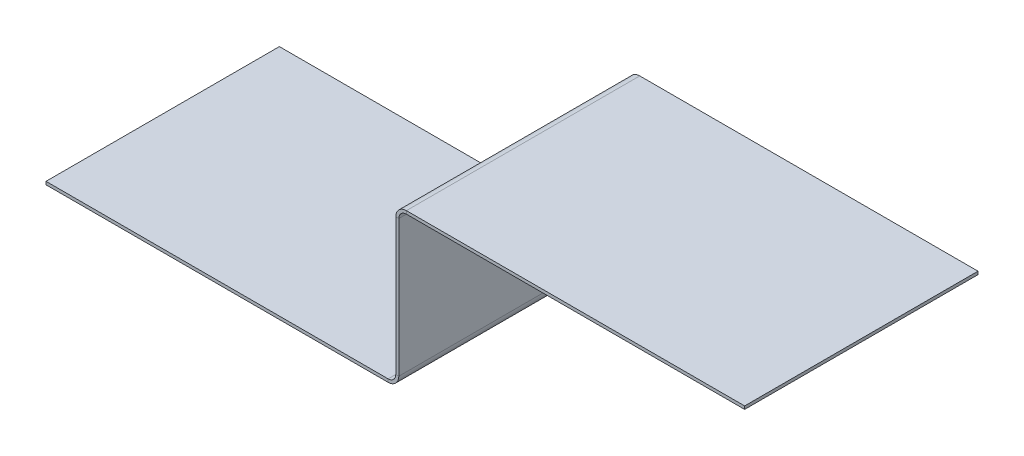
ISO-10303-21;
HEADER;
FILE_DESCRIPTION(('STEP AP214'),'2;1');
FILE_NAME('part.step','',(''),(''),'','','');
FILE_SCHEMA(('AUTOMOTIVE_DESIGN { 1 0 10303 214 1 1 1 1 }'));
ENDSEC;
DATA;
#1=APPLICATION_CONTEXT('core data for automotive mechanical design processes');
#2=APPLICATION_PROTOCOL_DEFINITION('international standard','automotive_design',2000,#1);
#3=PRODUCT_CONTEXT('',#1,'mechanical');
#4=PRODUCT('Part','Part','',(#3));
#5=PRODUCT_RELATED_PRODUCT_CATEGORY('part','',(#4));
#6=PRODUCT_DEFINITION_FORMATION('','',#4);
#7=PRODUCT_DEFINITION_CONTEXT('part definition',#1,'design');
#8=PRODUCT_DEFINITION('design','',#6,#7);
#9=PRODUCT_DEFINITION_SHAPE('','',#8);
#10=(LENGTH_UNIT() NAMED_UNIT(*) SI_UNIT(.MILLI.,.METRE.));
#11=(NAMED_UNIT(*) PLANE_ANGLE_UNIT() SI_UNIT($,.RADIAN.));
#12=(NAMED_UNIT(*) SI_UNIT($,.STERADIAN.) SOLID_ANGLE_UNIT());
#13=UNCERTAINTY_MEASURE_WITH_UNIT(LENGTH_MEASURE(1.E-05),#10,'distance_accuracy_value','');
#14=(GEOMETRIC_REPRESENTATION_CONTEXT(3) GLOBAL_UNCERTAINTY_ASSIGNED_CONTEXT((#13)) GLOBAL_UNIT_ASSIGNED_CONTEXT((#10,
#11,#12)) REPRESENTATION_CONTEXT('',''));
#15=CARTESIAN_POINT('',(0.,0.,0.));
#16=DIRECTION('',(0.,0.,1.));
#17=DIRECTION('',(1.,0.,0.));
#18=AXIS2_PLACEMENT_3D('',#15,#16,#17);
#19=CARTESIAN_POINT('',(0.143805509807659,0.143805509807657,0.));
#20=DIRECTION('',(-1.,0.,0.));
#21=DIRECTION('',(0.,0.,1.));
#22=AXIS2_PLACEMENT_3D('',#19,#20,#21);
#23=PLANE('',#22);
#24=DIRECTION('',(0.,1.,0.));
#25=VECTOR('',#24,1.);
#26=CARTESIAN_POINT('',(0.14380550980806,-114.936406124365,38.4403217383326));
#27=LINE('',#26,#25);
#28=CARTESIAN_POINT('',(0.14380550980765,2.50000000000001,38.4403217383326));
#29=VERTEX_POINT('',#28);
#30=CARTESIAN_POINT('',(0.143805509807493,47.5,38.4403217383326));
#31=VERTEX_POINT('',#30);
#32=EDGE_CURVE('E287',#29,#31,#27,.T.);
#33=ORIENTED_EDGE('',*,*,#32,.T.);
#34=DIRECTION('',(0.,0.,-1.));
#35=VECTOR('',#34,1.);
#36=CARTESIAN_POINT('',(0.143805509807493,47.5,0.));
#37=LINE('',#36,#35);
#38=CARTESIAN_POINT('',(0.143805509807493,47.5,-38.4403217383326));
#39=VERTEX_POINT('',#38);
#40=EDGE_CURVE('E57',#31,#39,#37,.T.);
#41=ORIENTED_EDGE('',*,*,#40,.T.);
#42=DIRECTION('',(0.,-1.,0.));
#43=VECTOR('',#42,1.);
#44=CARTESIAN_POINT('',(0.14380550980806,-114.936406124365,-38.4403217383326));
#45=LINE('',#44,#43);
#46=CARTESIAN_POINT('',(0.14380550980765,2.50000000000001,-38.4403217383326));
#47=VERTEX_POINT('',#46);
#48=EDGE_CURVE('E73',#39,#47,#45,.T.);
#49=ORIENTED_EDGE('',*,*,#48,.T.);
#50=DIRECTION('',(0.,0.,-1.));
#51=VECTOR('',#50,1.);
#52=CARTESIAN_POINT('',(0.14380550980765,2.50000000000001,0.));
#53=LINE('',#52,#51);
#54=EDGE_CURVE('E266',#29,#47,#53,.T.);
#55=ORIENTED_EDGE('',*,*,#54,.F.);
#56=EDGE_LOOP('',(#33,#41,#49,#55));
#57=FACE_BOUND('',#56,.T.);
#58=ADVANCED_FACE('F47',(#57),#23,.T.);
#59=CARTESIAN_POINT('',(1.14380550980806,-114.936406124365,-38.4403217383326));
#60=DIRECTION('',(0.,0.,-1.));
#61=DIRECTION('',(0.,-1.,0.));
#62=AXIS2_PLACEMENT_3D('',#59,#60,#61);
#63=PLANE('',#62);
#64=ORIENTED_EDGE('',*,*,#48,.F.);
#65=DIRECTION('',(1.,0.,0.));
#66=VECTOR('',#65,1.);
#67=CARTESIAN_POINT('',(1.14380550980749,47.5,-38.4403217383326));
#68=LINE('',#67,#66);
#69=CARTESIAN_POINT('',(1.14380550980749,47.5,-38.4403217383326));
#70=VERTEX_POINT('',#69);
#71=EDGE_CURVE('E277',#39,#70,#68,.T.);
#72=ORIENTED_EDGE('',*,*,#71,.T.);
#73=DIRECTION('',(0.,-1.,0.));
#74=VECTOR('',#73,1.);
#75=CARTESIAN_POINT('',(1.14380550980806,-114.936406124365,-38.4403217383326));
#76=LINE('',#75,#74);
#77=CARTESIAN_POINT('',(1.14380550980765,2.50000000000001,-38.4403217383326));
#78=VERTEX_POINT('',#77);
#79=EDGE_CURVE('E51',#70,#78,#76,.T.);
#80=ORIENTED_EDGE('',*,*,#79,.T.);
#81=DIRECTION('',(1.,0.,0.));
#82=VECTOR('',#81,1.);
#83=CARTESIAN_POINT('',(1.14380550980765,2.50000000000001,-38.4403217383326));
#84=LINE('',#83,#82);
#85=EDGE_CURVE('E270',#47,#78,#84,.T.);
#86=ORIENTED_EDGE('',*,*,#85,.F.);
#87=EDGE_LOOP('',(#64,#72,#80,#86));
#88=FACE_BOUND('',#87,.T.);
#89=ADVANCED_FACE('F294',(#88),#63,.T.);
#90=CARTESIAN_POINT('',(1.14380550980806,-114.936406124365,38.4403217383326));
#91=DIRECTION('',(0.,0.,1.));
#92=DIRECTION('',(0.,1.,0.));
#93=AXIS2_PLACEMENT_3D('',#90,#91,#92);
#94=PLANE('',#93);
#95=DIRECTION('',(0.,1.,0.));
#96=VECTOR('',#95,1.);
#97=CARTESIAN_POINT('',(1.14380550980806,-114.936406124365,38.4403217383326));
#98=LINE('',#97,#96);
#99=CARTESIAN_POINT('',(1.14380550980765,2.50000000000001,38.4403217383326));
#100=VERTEX_POINT('',#99);
#101=CARTESIAN_POINT('',(1.14380550980749,47.5,38.4403217383326));
#102=VERTEX_POINT('',#101);
#103=EDGE_CURVE('E262',#100,#102,#98,.T.);
#104=ORIENTED_EDGE('',*,*,#103,.T.);
#105=DIRECTION('',(-1.,0.,0.));
#106=VECTOR('',#105,1.);
#107=CARTESIAN_POINT('',(1.14380550980749,47.5,38.4403217383326));
#108=LINE('',#107,#106);
#109=EDGE_CURVE('E12',#102,#31,#108,.T.);
#110=ORIENTED_EDGE('',*,*,#109,.T.);
#111=ORIENTED_EDGE('',*,*,#32,.F.);
#112=DIRECTION('',(-1.,0.,0.));
#113=VECTOR('',#112,1.);
#114=CARTESIAN_POINT('',(1.14380550980765,2.50000000000001,38.4403217383326));
#115=LINE('',#114,#113);
#116=EDGE_CURVE('E261',#100,#29,#115,.T.);
#117=ORIENTED_EDGE('',*,*,#116,.F.);
#118=EDGE_LOOP('',(#104,#110,#111,#117));
#119=FACE_BOUND('',#118,.T.);
#120=ADVANCED_FACE('F49',(#119),#94,.T.);
#121=CARTESIAN_POINT('',(1.14380550980766,0.143805509807661,0.));
#122=DIRECTION('',(-1.,0.,0.));
#123=DIRECTION('',(0.,0.,1.));
#124=AXIS2_PLACEMENT_3D('',#121,#122,#123);
#125=PLANE('',#124);
#126=DIRECTION('',(0.,0.,-1.));
#127=VECTOR('',#126,1.);
#128=CARTESIAN_POINT('',(1.14380550980749,47.5,0.));
#129=LINE('',#128,#127);
#130=EDGE_CURVE('E274',#102,#70,#129,.T.);
#131=ORIENTED_EDGE('',*,*,#130,.F.);
#132=ORIENTED_EDGE('',*,*,#103,.F.);
#133=DIRECTION('',(0.,0.,-1.));
#134=VECTOR('',#133,1.);
#135=CARTESIAN_POINT('',(1.14380550980765,2.50000000000001,0.));
#136=LINE('',#135,#134);
#137=EDGE_CURVE('E258',#100,#78,#136,.T.);
#138=ORIENTED_EDGE('',*,*,#137,.T.);
#139=ORIENTED_EDGE('',*,*,#79,.F.);
#140=EDGE_LOOP('',(#131,#132,#138,#139));
#141=FACE_BOUND('',#140,.T.);
#142=ADVANCED_FACE('F334',(#141),#125,.F.);
#143=CARTESIAN_POINT('',(-115.080211634173,-1.,-38.4403217383326));
#144=DIRECTION('',(-1.,0.,0.));
#145=DIRECTION('',(0.,0.,1.));
#146=AXIS2_PLACEMENT_3D('',#143,#144,#145);
#147=PLANE('',#146);
#148=DIRECTION('',(0.,0.,1.));
#149=VECTOR('',#148,1.);
#150=CARTESIAN_POINT('',(-115.080211634173,0.,-38.4403217383326));
#151=LINE('',#150,#149);
#152=CARTESIAN_POINT('',(-115.080211634173,0.,-38.4403217383326));
#153=VERTEX_POINT('',#152);
#154=CARTESIAN_POINT('',(-115.080211634173,0.,38.4403217383326));
#155=VERTEX_POINT('',#154);
#156=EDGE_CURVE('E226',#153,#155,#151,.T.);
#157=ORIENTED_EDGE('',*,*,#156,.F.);
#158=DIRECTION('',(0.,1.,0.));
#159=VECTOR('',#158,1.);
#160=CARTESIAN_POINT('',(-115.080211634173,-1.,-38.4403217383326));
#161=LINE('',#160,#159);
#162=CARTESIAN_POINT('',(-115.080211634173,-1.,-38.4403217383326));
#163=VERTEX_POINT('',#162);
#164=EDGE_CURVE('E215',#163,#153,#161,.T.);
#165=ORIENTED_EDGE('',*,*,#164,.F.);
#166=DIRECTION('',(0.,0.,1.));
#167=VECTOR('',#166,1.);
#168=CARTESIAN_POINT('',(-115.080211634173,-1.,-38.4403217383326));
#169=LINE('',#168,#167);
#170=CARTESIAN_POINT('',(-115.080211634173,-1.,38.4403217383326));
#171=VERTEX_POINT('',#170);
#172=EDGE_CURVE('E252',#163,#171,#169,.T.);
#173=ORIENTED_EDGE('',*,*,#172,.T.);
#174=DIRECTION('',(0.,1.,0.));
#175=VECTOR('',#174,1.);
#176=CARTESIAN_POINT('',(-115.080211634173,-1.,38.4403217383326));
#177=LINE('',#176,#175);
#178=EDGE_CURVE('E249',#171,#155,#177,.T.);
#179=ORIENTED_EDGE('',*,*,#178,.T.);
#180=EDGE_LOOP('',(#157,#165,#173,#179));
#181=FACE_BOUND('',#180,.T.);
#182=ADVANCED_FACE('F317',(#181),#147,.T.);
#183=CARTESIAN_POINT('',(0.,-1.,0.));
#184=DIRECTION('',(0.,1.,0.));
#185=DIRECTION('',(0.,0.,1.));
#186=AXIS2_PLACEMENT_3D('',#183,#184,#185);
#187=PLANE('',#186);
#188=DIRECTION('',(0.,0.,-1.));
#189=VECTOR('',#188,1.);
#190=CARTESIAN_POINT('',(-2.35619449019235,-1.,0.));
#191=LINE('',#190,#189);
#192=CARTESIAN_POINT('',(-2.35619449019235,-1.,38.4403217383326));
#193=VERTEX_POINT('',#192);
#194=CARTESIAN_POINT('',(-2.35619449019235,-1.,-38.4403217383326));
#195=VERTEX_POINT('',#194);
#196=EDGE_CURVE('E209',#193,#195,#191,.T.);
#197=ORIENTED_EDGE('',*,*,#196,.F.);
#198=DIRECTION('',(1.,0.,0.));
#199=VECTOR('',#198,1.);
#200=CARTESIAN_POINT('',(-115.080211634173,-1.,38.4403217383326));
#201=LINE('',#200,#199);
#202=EDGE_CURVE('E245',#171,#193,#201,.T.);
#203=ORIENTED_EDGE('',*,*,#202,.F.);
#204=ORIENTED_EDGE('',*,*,#172,.F.);
#205=DIRECTION('',(-1.,0.,0.));
#206=VECTOR('',#205,1.);
#207=CARTESIAN_POINT('',(-115.080211634173,-1.,-38.4403217383326));
#208=LINE('',#207,#206);
#209=EDGE_CURVE('E219',#195,#163,#208,.T.);
#210=ORIENTED_EDGE('',*,*,#209,.F.);
#211=EDGE_LOOP('',(#197,#203,#204,#210));
#212=FACE_BOUND('',#211,.T.);
#213=ADVANCED_FACE('F309',(#212),#187,.F.);
#214=CARTESIAN_POINT('',(-115.080211634173,-1.,38.4403217383326));
#215=DIRECTION('',(0.,0.,1.));
#216=DIRECTION('',(1.,0.,0.));
#217=AXIS2_PLACEMENT_3D('',#214,#215,#216);
#218=PLANE('',#217);
#219=ORIENTED_EDGE('',*,*,#202,.T.);
#220=DIRECTION('',(0.,1.,0.));
#221=VECTOR('',#220,1.);
#222=CARTESIAN_POINT('',(-2.35619449019235,-1.,38.4403217383326));
#223=LINE('',#222,#221);
#224=CARTESIAN_POINT('',(-2.35619449019235,0.,38.4403217383326));
#225=VERTEX_POINT('',#224);
#226=EDGE_CURVE('E241',#193,#225,#223,.T.);
#227=ORIENTED_EDGE('',*,*,#226,.T.);
#228=DIRECTION('',(1.,0.,0.));
#229=VECTOR('',#228,1.);
#230=CARTESIAN_POINT('',(-115.080211634173,0.,38.4403217383326));
#231=LINE('',#230,#229);
#232=EDGE_CURVE('E237',#155,#225,#231,.T.);
#233=ORIENTED_EDGE('',*,*,#232,.F.);
#234=ORIENTED_EDGE('',*,*,#178,.F.);
#235=EDGE_LOOP('',(#219,#227,#233,#234));
#236=FACE_BOUND('',#235,.T.);
#237=ADVANCED_FACE('F312',(#236),#218,.T.);
#238=CARTESIAN_POINT('',(0.,0.,0.));
#239=DIRECTION('',(0.,1.,0.));
#240=DIRECTION('',(0.,0.,1.));
#241=AXIS2_PLACEMENT_3D('',#238,#239,#240);
#242=PLANE('',#241);
#243=ORIENTED_EDGE('',*,*,#232,.T.);
#244=DIRECTION('',(0.,0.,-1.));
#245=VECTOR('',#244,1.);
#246=CARTESIAN_POINT('',(-2.35619449019235,0.,0.));
#247=LINE('',#246,#245);
#248=CARTESIAN_POINT('',(-2.35619449019235,0.,-38.4403217383326));
#249=VERTEX_POINT('',#248);
#250=EDGE_CURVE('E233',#225,#249,#247,.T.);
#251=ORIENTED_EDGE('',*,*,#250,.T.);
#252=DIRECTION('',(-1.,0.,0.));
#253=VECTOR('',#252,1.);
#254=CARTESIAN_POINT('',(-115.080211634173,0.,-38.4403217383326));
#255=LINE('',#254,#253);
#256=EDGE_CURVE('E230',#249,#153,#255,.T.);
#257=ORIENTED_EDGE('',*,*,#256,.T.);
#258=ORIENTED_EDGE('',*,*,#156,.T.);
#259=EDGE_LOOP('',(#243,#251,#257,#258));
#260=FACE_BOUND('',#259,.T.);
#261=ADVANCED_FACE('F386',(#260),#242,.T.);
#262=CARTESIAN_POINT('',(-115.080211634173,-1.,-38.4403217383326));
#263=DIRECTION('',(0.,0.,-1.));
#264=DIRECTION('',(-1.,0.,0.));
#265=AXIS2_PLACEMENT_3D('',#262,#263,#264);
#266=PLANE('',#265);
#267=ORIENTED_EDGE('',*,*,#256,.F.);
#268=DIRECTION('',(0.,-1.,0.));
#269=VECTOR('',#268,1.);
#270=CARTESIAN_POINT('',(-2.35619449019235,-1.,-38.4403217383326));
#271=LINE('',#270,#269);
#272=EDGE_CURVE('E222',#249,#195,#271,.T.);
#273=ORIENTED_EDGE('',*,*,#272,.T.);
#274=ORIENTED_EDGE('',*,*,#209,.T.);
#275=ORIENTED_EDGE('',*,*,#164,.T.);
#276=EDGE_LOOP('',(#267,#273,#274,#275));
#277=FACE_BOUND('',#276,.T.);
#278=ADVANCED_FACE('F320',(#277),#266,.T.);
#279=CARTESIAN_POINT('',(-2.35619449019235,2.5,38.4403217383326));
#280=DIRECTION('',(0.,0.,1.));
#281=DIRECTION('',(1.,0.,0.));
#282=AXIS2_PLACEMENT_3D('',#279,#280,#281);
#283=PLANE('',#282);
#284=ORIENTED_EDGE('',*,*,#116,.T.);
#285=CARTESIAN_POINT('',(-2.35619449019235,2.5,38.4403217383326));
#286=DIRECTION('',(0.,0.,1.));
#287=DIRECTION('',(1.,0.,0.));
#288=AXIS2_PLACEMENT_3D('',#285,#286,#287);
#289=CIRCLE('',#288,2.5);
#290=EDGE_CURVE('E194',#29,#225,#289,.F.);
#291=ORIENTED_EDGE('',*,*,#290,.T.);
#292=ORIENTED_EDGE('',*,*,#226,.F.);
#293=CARTESIAN_POINT('',(-2.35619449019235,2.5,38.4403217383326));
#294=DIRECTION('',(0.,0.,-1.));
#295=DIRECTION('',(1.,0.,0.));
#296=AXIS2_PLACEMENT_3D('',#293,#294,#295);
#297=CIRCLE('',#296,3.5);
#298=EDGE_CURVE('E200',#100,#193,#297,.T.);
#299=ORIENTED_EDGE('',*,*,#298,.F.);
#300=EDGE_LOOP('',(#284,#291,#292,#299));
#301=FACE_BOUND('',#300,.T.);
#302=ADVANCED_FACE('F327',(#301),#283,.T.);
#303=CARTESIAN_POINT('',(-2.35619449019235,2.5,-38.4403217383326));
#304=DIRECTION('',(0.,0.,-1.));
#305=DIRECTION('',(-1.,0.,0.));
#306=AXIS2_PLACEMENT_3D('',#303,#304,#305);
#307=PLANE('',#306);
#308=ORIENTED_EDGE('',*,*,#272,.F.);
#309=CARTESIAN_POINT('',(-2.35619449019235,2.5,-38.4403217383326));
#310=DIRECTION('',(0.,0.,1.));
#311=DIRECTION('',(1.,0.,0.));
#312=AXIS2_PLACEMENT_3D('',#309,#310,#311);
#313=CIRCLE('',#312,2.5);
#314=EDGE_CURVE('E205',#249,#47,#313,.T.);
#315=ORIENTED_EDGE('',*,*,#314,.T.);
#316=ORIENTED_EDGE('',*,*,#85,.T.);
#317=CARTESIAN_POINT('',(-2.35619449019235,2.5,-38.4403217383326));
#318=DIRECTION('',(0.,0.,1.));
#319=DIRECTION('',(-1.,0.,0.));
#320=AXIS2_PLACEMENT_3D('',#317,#318,#319);
#321=CIRCLE('',#320,3.5);
#322=EDGE_CURVE('E204',#195,#78,#321,.T.);
#323=ORIENTED_EDGE('',*,*,#322,.F.);
#324=EDGE_LOOP('',(#308,#315,#316,#323));
#325=FACE_BOUND('',#324,.T.);
#326=ADVANCED_FACE('F299',(#325),#307,.T.);
#327=CARTESIAN_POINT('',(-2.35619449019235,2.5,-77.0314218438719));
#328=DIRECTION('',(0.,0.,1.));
#329=DIRECTION('',(1.,0.,0.));
#330=AXIS2_PLACEMENT_3D('',#327,#328,#329);
#331=CYLINDRICAL_SURFACE('',#330,3.5);
#332=ORIENTED_EDGE('',*,*,#322,.T.);
#333=ORIENTED_EDGE('',*,*,#137,.F.);
#334=ORIENTED_EDGE('',*,*,#298,.T.);
#335=ORIENTED_EDGE('',*,*,#196,.T.);
#336=EDGE_LOOP('',(#332,#333,#334,#335));
#337=FACE_BOUND('',#336,.T.);
#338=ADVANCED_FACE('F304',(#337),#331,.T.);
#339=CARTESIAN_POINT('',(-2.35619449019235,2.5,-77.0314218438719));
#340=DIRECTION('',(0.,0.,1.));
#341=DIRECTION('',(1.,0.,0.));
#342=AXIS2_PLACEMENT_3D('',#339,#340,#341);
#343=CYLINDRICAL_SURFACE('',#342,2.5);
#344=ORIENTED_EDGE('',*,*,#314,.F.);
#345=ORIENTED_EDGE('',*,*,#250,.F.);
#346=ORIENTED_EDGE('',*,*,#290,.F.);
#347=ORIENTED_EDGE('',*,*,#54,.T.);
#348=EDGE_LOOP('',(#344,#345,#346,#347));
#349=FACE_BOUND('',#348,.T.);
#350=ADVANCED_FACE('F323',(#349),#343,.F.);
#351=CARTESIAN_POINT('',(3.64380550980749,47.5,38.4403217383326));
#352=DIRECTION('',(0.,0.,-1.));
#353=DIRECTION('',(-1.,0.,0.));
#354=AXIS2_PLACEMENT_3D('',#351,#352,#353);
#355=PLANE('',#354);
#356=DIRECTION('',(0.,1.,0.));
#357=VECTOR('',#356,1.);
#358=CARTESIAN_POINT('',(3.64380550980749,50.,38.4403217383326));
#359=LINE('',#358,#357);
#360=CARTESIAN_POINT('',(3.64380550980749,50.,38.4403217383326));
#361=VERTEX_POINT('',#360);
#362=CARTESIAN_POINT('',(3.64380550980749,51.,38.4403217383326));
#363=VERTEX_POINT('',#362);
#364=EDGE_CURVE('E147',#361,#363,#359,.T.);
#365=ORIENTED_EDGE('',*,*,#364,.T.);
#366=CARTESIAN_POINT('',(3.64380550980749,47.5,38.4403217383326));
#367=DIRECTION('',(0.,0.,1.));
#368=DIRECTION('',(1.,0.,0.));
#369=AXIS2_PLACEMENT_3D('',#366,#367,#368);
#370=CIRCLE('',#369,3.5);
#371=EDGE_CURVE('E65',#363,#31,#370,.T.);
#372=ORIENTED_EDGE('',*,*,#371,.T.);
#373=ORIENTED_EDGE('',*,*,#109,.F.);
#374=CARTESIAN_POINT('',(3.64380550980749,47.5,38.4403217383326));
#375=DIRECTION('',(0.,0.,1.));
#376=DIRECTION('',(-1.,0.,0.));
#377=AXIS2_PLACEMENT_3D('',#374,#375,#376);
#378=CIRCLE('',#377,2.5);
#379=EDGE_CURVE('E185',#361,#102,#378,.T.);
#380=ORIENTED_EDGE('',*,*,#379,.F.);
#381=EDGE_LOOP('',(#365,#372,#373,#380));
#382=FACE_BOUND('',#381,.T.);
#383=ADVANCED_FACE('F329',(#382),#355,.F.);
#384=CARTESIAN_POINT('',(3.64380550980749,47.5,-38.4403217383326));
#385=DIRECTION('',(0.,0.,1.));
#386=DIRECTION('',(1.,0.,0.));
#387=AXIS2_PLACEMENT_3D('',#384,#385,#386);
#388=PLANE('',#387);
#389=ORIENTED_EDGE('',*,*,#71,.F.);
#390=CARTESIAN_POINT('',(3.64380550980749,47.5,-38.4403217383326));
#391=DIRECTION('',(0.,0.,1.));
#392=DIRECTION('',(1.,0.,0.));
#393=AXIS2_PLACEMENT_3D('',#390,#391,#392);
#394=CIRCLE('',#393,3.5);
#395=CARTESIAN_POINT('',(3.64380550980749,51.,-38.4403217383326));
#396=VERTEX_POINT('',#395);
#397=EDGE_CURVE('E190',#39,#396,#394,.F.);
#398=ORIENTED_EDGE('',*,*,#397,.T.);
#399=DIRECTION('',(0.,-1.,0.));
#400=VECTOR('',#399,1.);
#401=CARTESIAN_POINT('',(3.64380550980749,50.,-38.4403217383326));
#402=LINE('',#401,#400);
#403=CARTESIAN_POINT('',(3.64380550980749,50.,-38.4403217383326));
#404=VERTEX_POINT('',#403);
#405=EDGE_CURVE('E169',#396,#404,#402,.T.);
#406=ORIENTED_EDGE('',*,*,#405,.T.);
#407=CARTESIAN_POINT('',(3.64380550980749,47.5,-38.4403217383326));
#408=DIRECTION('',(0.,0.,-1.));
#409=DIRECTION('',(1.,0.,0.));
#410=AXIS2_PLACEMENT_3D('',#407,#408,#409);
#411=CIRCLE('',#410,2.5);
#412=EDGE_CURVE('E189',#70,#404,#411,.T.);
#413=ORIENTED_EDGE('',*,*,#412,.F.);
#414=EDGE_LOOP('',(#389,#398,#406,#413));
#415=FACE_BOUND('',#414,.T.);
#416=ADVANCED_FACE('F450',(#415),#388,.F.);
#417=CARTESIAN_POINT('',(3.64380550980749,47.5,-77.0314218438719));
#418=DIRECTION('',(0.,0.,1.));
#419=DIRECTION('',(1.,0.,0.));
#420=AXIS2_PLACEMENT_3D('',#417,#418,#419);
#421=CYLINDRICAL_SURFACE('',#420,2.5);
#422=ORIENTED_EDGE('',*,*,#412,.T.);
#423=DIRECTION('',(0.,0.,-1.));
#424=VECTOR('',#423,1.);
#425=CARTESIAN_POINT('',(3.64380550980749,50.,0.));
#426=LINE('',#425,#424);
#427=EDGE_CURVE('E173',#361,#404,#426,.T.);
#428=ORIENTED_EDGE('',*,*,#427,.F.);
#429=ORIENTED_EDGE('',*,*,#379,.T.);
#430=ORIENTED_EDGE('',*,*,#130,.T.);
#431=EDGE_LOOP('',(#422,#428,#429,#430));
#432=FACE_BOUND('',#431,.T.);
#433=ADVANCED_FACE('F332',(#432),#421,.F.);
#434=CARTESIAN_POINT('',(3.64380550980749,47.5,-77.0314218438719));
#435=DIRECTION('',(0.,0.,1.));
#436=DIRECTION('',(1.,0.,0.));
#437=AXIS2_PLACEMENT_3D('',#434,#435,#436);
#438=CYLINDRICAL_SURFACE('',#437,3.5);
#439=ORIENTED_EDGE('',*,*,#397,.F.);
#440=ORIENTED_EDGE('',*,*,#40,.F.);
#441=ORIENTED_EDGE('',*,*,#371,.F.);
#442=DIRECTION('',(0.,0.,-1.));
#443=VECTOR('',#442,1.);
#444=CARTESIAN_POINT('',(3.64380550980749,51.,0.));
#445=LINE('',#444,#443);
#446=EDGE_CURVE('E176',#363,#396,#445,.T.);
#447=ORIENTED_EDGE('',*,*,#446,.T.);
#448=EDGE_LOOP('',(#439,#440,#441,#447));
#449=FACE_BOUND('',#448,.T.);
#450=ADVANCED_FACE('F470',(#449),#438,.T.);
#451=CARTESIAN_POINT('',(115.080211634173,50.,-38.4403217383326));
#452=DIRECTION('',(1.,0.,0.));
#453=DIRECTION('',(0.,0.,-1.));
#454=AXIS2_PLACEMENT_3D('',#451,#452,#453);
#455=PLANE('',#454);
#456=DIRECTION('',(0.,0.,-1.));
#457=VECTOR('',#456,1.);
#458=CARTESIAN_POINT('',(115.080211634173,51.,-38.4403217383326));
#459=LINE('',#458,#457);
#460=CARTESIAN_POINT('',(115.080211634173,51.,38.4403217383326));
#461=VERTEX_POINT('',#460);
#462=CARTESIAN_POINT('',(115.080211634173,51.,-38.4403217383326));
#463=VERTEX_POINT('',#462);
#464=EDGE_CURVE('E161',#461,#463,#459,.T.);
#465=ORIENTED_EDGE('',*,*,#464,.F.);
#466=DIRECTION('',(0.,1.,0.));
#467=VECTOR('',#466,1.);
#468=CARTESIAN_POINT('',(115.080211634173,50.,38.4403217383326));
#469=LINE('',#468,#467);
#470=CARTESIAN_POINT('',(115.080211634173,50.,38.4403217383326));
#471=VERTEX_POINT('',#470);
#472=EDGE_CURVE('E145',#471,#461,#469,.T.);
#473=ORIENTED_EDGE('',*,*,#472,.F.);
#474=DIRECTION('',(0.,0.,-1.));
#475=VECTOR('',#474,1.);
#476=CARTESIAN_POINT('',(115.080211634173,50.,-38.4403217383326));
#477=LINE('',#476,#475);
#478=CARTESIAN_POINT('',(115.080211634173,50.,-38.4403217383326));
#479=VERTEX_POINT('',#478);
#480=EDGE_CURVE('E159',#471,#479,#477,.T.);
#481=ORIENTED_EDGE('',*,*,#480,.T.);
#482=DIRECTION('',(0.,1.,0.));
#483=VECTOR('',#482,1.);
#484=CARTESIAN_POINT('',(115.080211634173,50.,-38.4403217383326));
#485=LINE('',#484,#483);
#486=EDGE_CURVE('E168',#479,#463,#485,.T.);
#487=ORIENTED_EDGE('',*,*,#486,.T.);
#488=EDGE_LOOP('',(#465,#473,#481,#487));
#489=FACE_BOUND('',#488,.T.);
#490=ADVANCED_FACE('F157',(#489),#455,.T.);
#491=CARTESIAN_POINT('',(-48.4247779607696,50.,0.));
#492=DIRECTION('',(0.,1.,0.));
#493=DIRECTION('',(0.,0.,1.));
#494=AXIS2_PLACEMENT_3D('',#491,#492,#493);
#495=PLANE('',#494);
#496=DIRECTION('',(1.,0.,0.));
#497=VECTOR('',#496,1.);
#498=CARTESIAN_POINT('',(-163.504989594942,50.,38.4403217383326));
#499=LINE('',#498,#497);
#500=EDGE_CURVE('E142',#361,#471,#499,.T.);
#501=ORIENTED_EDGE('',*,*,#500,.F.);
#502=ORIENTED_EDGE('',*,*,#427,.T.);
#503=DIRECTION('',(-1.,0.,0.));
#504=VECTOR('',#503,1.);
#505=CARTESIAN_POINT('',(-163.504989594942,50.,-38.4403217383326));
#506=LINE('',#505,#504);
#507=EDGE_CURVE('E165',#479,#404,#506,.T.);
#508=ORIENTED_EDGE('',*,*,#507,.F.);
#509=ORIENTED_EDGE('',*,*,#480,.F.);
#510=EDGE_LOOP('',(#501,#502,#508,#509));
#511=FACE_BOUND('',#510,.T.);
#512=ADVANCED_FACE('F164',(#511),#495,.F.);
#513=CARTESIAN_POINT('',(-163.504989594942,50.,-38.4403217383326));
#514=DIRECTION('',(0.,0.,-1.));
#515=DIRECTION('',(-1.,0.,0.));
#516=AXIS2_PLACEMENT_3D('',#513,#514,#515);
#517=PLANE('',#516);
#518=ORIENTED_EDGE('',*,*,#405,.F.);
#519=DIRECTION('',(-1.,0.,0.));
#520=VECTOR('',#519,1.);
#521=CARTESIAN_POINT('',(-163.504989594942,51.,-38.4403217383326));
#522=LINE('',#521,#520);
#523=EDGE_CURVE('E153',#463,#396,#522,.T.);
#524=ORIENTED_EDGE('',*,*,#523,.F.);
#525=ORIENTED_EDGE('',*,*,#486,.F.);
#526=ORIENTED_EDGE('',*,*,#507,.T.);
#527=EDGE_LOOP('',(#518,#524,#525,#526));
#528=FACE_BOUND('',#527,.T.);
#529=ADVANCED_FACE('F498',(#528),#517,.T.);
#530=CARTESIAN_POINT('',(-48.4247779607696,51.,0.));
#531=DIRECTION('',(0.,1.,0.));
#532=DIRECTION('',(0.,0.,1.));
#533=AXIS2_PLACEMENT_3D('',#530,#531,#532);
#534=PLANE('',#533);
#535=ORIENTED_EDGE('',*,*,#446,.F.);
#536=DIRECTION('',(1.,0.,0.));
#537=VECTOR('',#536,1.);
#538=CARTESIAN_POINT('',(-163.504989594942,51.,38.4403217383326));
#539=LINE('',#538,#537);
#540=EDGE_CURVE('E548',#363,#461,#539,.T.);
#541=ORIENTED_EDGE('',*,*,#540,.T.);
#542=ORIENTED_EDGE('',*,*,#464,.T.);
#543=ORIENTED_EDGE('',*,*,#523,.T.);
#544=EDGE_LOOP('',(#535,#541,#542,#543));
#545=FACE_BOUND('',#544,.T.);
#546=ADVANCED_FACE('F508',(#545),#534,.T.);
#547=CARTESIAN_POINT('',(-163.504989594942,50.,38.4403217383326));
#548=DIRECTION('',(0.,0.,1.));
#549=DIRECTION('',(1.,0.,0.));
#550=AXIS2_PLACEMENT_3D('',#547,#548,#549);
#551=PLANE('',#550);
#552=ORIENTED_EDGE('',*,*,#364,.F.);
#553=ORIENTED_EDGE('',*,*,#500,.T.);
#554=ORIENTED_EDGE('',*,*,#472,.T.);
#555=ORIENTED_EDGE('',*,*,#540,.F.);
#556=EDGE_LOOP('',(#552,#553,#554,#555));
#557=FACE_BOUND('',#556,.T.);
#558=ADVANCED_FACE('F144',(#557),#551,.T.);
#559=CLOSED_SHELL('',(#58,#89,#120,#142,#182,#213,#237,#261,#278,#302,#326,#338,#350,#383,#416,
#433,#450,#490,#512,#529,#546,#558));
#560=MANIFOLD_SOLID_BREP('B2',#559);
#561=ADVANCED_BREP_SHAPE_REPRESENTATION('',(#18,#560),#14);
#562=SHAPE_DEFINITION_REPRESENTATION(#9,#561);
ENDSEC;
END-ISO-10303-21;
